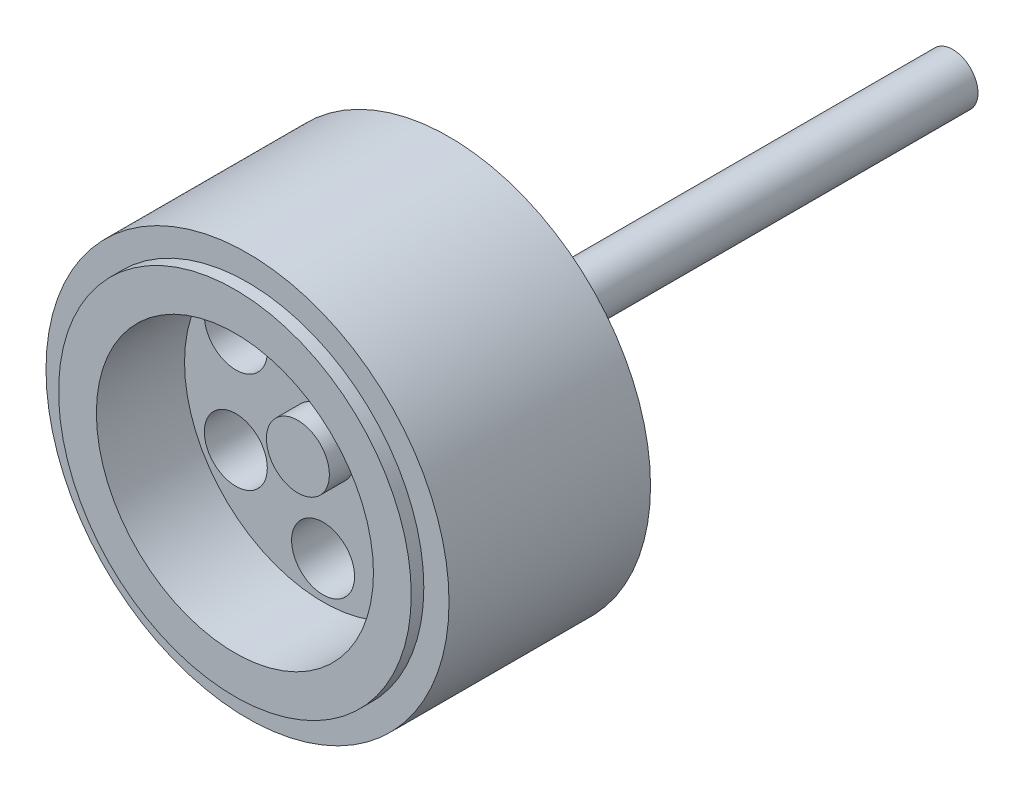
ISO-10303-21;
HEADER;
FILE_DESCRIPTION(('STEP AP214'),'2;1');
FILE_NAME('part.step','',(''),(''),'','','');
FILE_SCHEMA(('AUTOMOTIVE_DESIGN { 1 0 10303 214 1 1 1 1 }'));
ENDSEC;
DATA;
#1=APPLICATION_CONTEXT('core data for automotive mechanical design processes');
#2=APPLICATION_PROTOCOL_DEFINITION('international standard','automotive_design',2000,#1);
#3=PRODUCT_CONTEXT('',#1,'mechanical');
#4=PRODUCT('Part','Part','',(#3));
#5=PRODUCT_RELATED_PRODUCT_CATEGORY('part','',(#4));
#6=PRODUCT_DEFINITION_FORMATION('','',#4);
#7=PRODUCT_DEFINITION_CONTEXT('part definition',#1,'design');
#8=PRODUCT_DEFINITION('design','',#6,#7);
#9=PRODUCT_DEFINITION_SHAPE('','',#8);
#10=(LENGTH_UNIT() NAMED_UNIT(*) SI_UNIT(.MILLI.,.METRE.));
#11=(NAMED_UNIT(*) PLANE_ANGLE_UNIT() SI_UNIT($,.RADIAN.));
#12=(NAMED_UNIT(*) SI_UNIT($,.STERADIAN.) SOLID_ANGLE_UNIT());
#13=UNCERTAINTY_MEASURE_WITH_UNIT(LENGTH_MEASURE(1.E-05),#10,'distance_accuracy_value','');
#14=(GEOMETRIC_REPRESENTATION_CONTEXT(3) GLOBAL_UNCERTAINTY_ASSIGNED_CONTEXT((#13)) GLOBAL_UNIT_ASSIGNED_CONTEXT((#10,
#11,#12)) REPRESENTATION_CONTEXT('',''));
#15=CARTESIAN_POINT('',(0.,0.,0.));
#16=DIRECTION('',(0.,0.,1.));
#17=DIRECTION('',(1.,0.,0.));
#18=AXIS2_PLACEMENT_3D('',#15,#16,#17);
#19=CARTESIAN_POINT('',(0.,0.,0.));
#20=DIRECTION('',(0.,0.,1.));
#21=DIRECTION('',(1.,0.,0.));
#22=AXIS2_PLACEMENT_3D('',#19,#20,#21);
#23=CYLINDRICAL_SURFACE('',#22,32.);
#24=CARTESIAN_POINT('',(0.,0.,11.999));
#25=DIRECTION('',(0.,0.,1.));
#26=DIRECTION('',(1.,0.,0.));
#27=AXIS2_PLACEMENT_3D('',#24,#25,#26);
#28=CIRCLE('',#27,32.);
#29=CARTESIAN_POINT('',(32.,0.,11.999));
#30=VERTEX_POINT('',#29);
#31=EDGE_CURVE('E11',#30,#30,#28,.T.);
#32=ORIENTED_EDGE('',*,*,#31,.F.);
#33=EDGE_LOOP('',(#32));
#34=FACE_BOUND('',#33,.T.);
#35=CARTESIAN_POINT('',(0.,0.,-19.999));
#36=DIRECTION('',(0.,0.,1.));
#37=DIRECTION('',(1.,0.,0.));
#38=AXIS2_PLACEMENT_3D('',#35,#36,#37);
#39=CIRCLE('',#38,32.);
#40=CARTESIAN_POINT('',(32.,0.,-19.999));
#41=VERTEX_POINT('',#40);
#42=EDGE_CURVE('E55',#41,#41,#39,.T.);
#43=ORIENTED_EDGE('',*,*,#42,.T.);
#44=EDGE_LOOP('',(#43));
#45=FACE_BOUND('',#44,.T.);
#46=ADVANCED_FACE('F41',(#34,#45),#23,.T.);
#47=CARTESIAN_POINT('',(0.,32.,11.999));
#48=DIRECTION('',(0.,0.,-1.));
#49=DIRECTION('',(-1.,0.,0.));
#50=AXIS2_PLACEMENT_3D('',#47,#48,#49);
#51=PLANE('',#50);
#52=CARTESIAN_POINT('',(0.,0.,11.999));
#53=DIRECTION('',(0.,0.,1.));
#54=DIRECTION('',(1.,0.,0.));
#55=AXIS2_PLACEMENT_3D('',#52,#53,#54);
#56=CIRCLE('',#55,26.001);
#57=CARTESIAN_POINT('',(26.001,0.,11.999));
#58=VERTEX_POINT('',#57);
#59=EDGE_CURVE('E47',#58,#58,#56,.T.);
#60=ORIENTED_EDGE('',*,*,#59,.F.);
#61=EDGE_LOOP('',(#60));
#62=FACE_BOUND('',#61,.T.);
#63=ORIENTED_EDGE('',*,*,#31,.T.);
#64=EDGE_LOOP('',(#63));
#65=FACE_BOUND('',#64,.T.);
#66=ADVANCED_FACE('F70',(#62,#65),#51,.F.);
#67=CARTESIAN_POINT('',(0.,0.,0.));
#68=DIRECTION('',(0.,0.,1.));
#69=DIRECTION('',(1.,0.,0.));
#70=AXIS2_PLACEMENT_3D('',#67,#68,#69);
#71=CYLINDRICAL_SURFACE('',#70,26.001);
#72=CARTESIAN_POINT('',(0.,0.,-19.999));
#73=DIRECTION('',(0.,0.,1.));
#74=DIRECTION('',(1.,0.,0.));
#75=AXIS2_PLACEMENT_3D('',#72,#73,#74);
#76=CIRCLE('',#75,26.001);
#77=CARTESIAN_POINT('',(26.001,0.,-19.999));
#78=VERTEX_POINT('',#77);
#79=EDGE_CURVE('E51',#78,#78,#76,.T.);
#80=ORIENTED_EDGE('',*,*,#79,.F.);
#81=EDGE_LOOP('',(#80));
#82=FACE_BOUND('',#81,.T.);
#83=ORIENTED_EDGE('',*,*,#59,.T.);
#84=EDGE_LOOP('',(#83));
#85=FACE_BOUND('',#84,.T.);
#86=ADVANCED_FACE('F65',(#82,#85),#71,.F.);
#87=CARTESIAN_POINT('',(0.,26.001,-19.999));
#88=DIRECTION('',(0.,0.,1.));
#89=DIRECTION('',(1.,0.,0.));
#90=AXIS2_PLACEMENT_3D('',#87,#88,#89);
#91=PLANE('',#90);
#92=ORIENTED_EDGE('',*,*,#42,.F.);
#93=EDGE_LOOP('',(#92));
#94=FACE_BOUND('',#93,.T.);
#95=ORIENTED_EDGE('',*,*,#79,.T.);
#96=EDGE_LOOP('',(#95));
#97=FACE_BOUND('',#96,.T.);
#98=ADVANCED_FACE('F62',(#94,#97),#91,.F.);
#99=CLOSED_SHELL('',(#46,#66,#86,#98));
#100=MANIFOLD_SOLID_BREP('B2',#99);
#101=CARTESIAN_POINT('',(0.,22.,-8.));
#102=DIRECTION('',(0.,0.,1.));
#103=DIRECTION('',(1.,0.,0.));
#104=AXIS2_PLACEMENT_3D('',#101,#102,#103);
#105=PLANE('',#104);
#106=CARTESIAN_POINT('',(13.8564064605514,8.00000000000074,-8.));
#107=DIRECTION('',(0.,0.,1.));
#108=DIRECTION('',(1.,0.,0.));
#109=AXIS2_PLACEMENT_3D('',#106,#107,#108);
#110=CIRCLE('',#109,5.);
#111=CARTESIAN_POINT('',(18.8564064605514,8.00000000000074,-8.));
#112=VERTEX_POINT('',#111);
#113=EDGE_CURVE('E156',#112,#112,#110,.F.);
#114=ORIENTED_EDGE('',*,*,#113,.F.);
#115=EDGE_LOOP('',(#114));
#116=FACE_BOUND('',#115,.T.);
#117=CARTESIAN_POINT('',(13.8564064605523,-7.99999999999926,-8.));
#118=DIRECTION('',(0.,0.,1.));
#119=DIRECTION('',(1.,0.,0.));
#120=AXIS2_PLACEMENT_3D('',#117,#118,#119);
#121=CIRCLE('',#120,5.);
#122=CARTESIAN_POINT('',(18.8564064605523,-7.99999999999926,-8.));
#123=VERTEX_POINT('',#122);
#124=EDGE_CURVE('E171',#123,#123,#121,.F.);
#125=ORIENTED_EDGE('',*,*,#124,.F.);
#126=EDGE_LOOP('',(#125));
#127=FACE_BOUND('',#126,.T.);
#128=CARTESIAN_POINT('',(1.7021889376992E-12,-16.,-8.));
#129=DIRECTION('',(0.,0.,1.));
#130=DIRECTION('',(1.,0.,0.));
#131=AXIS2_PLACEMENT_3D('',#128,#129,#130);
#132=CIRCLE('',#131,5.);
#133=CARTESIAN_POINT('',(5.0000000000017,-16.,-8.));
#134=VERTEX_POINT('',#133);
#135=EDGE_CURVE('E165',#134,#134,#132,.F.);
#136=ORIENTED_EDGE('',*,*,#135,.F.);
#137=EDGE_LOOP('',(#136));
#138=FACE_BOUND('',#137,.T.);
#139=CARTESIAN_POINT('',(-13.8564064605506,7.99999999999925,-8.));
#140=DIRECTION('',(0.,0.,1.));
#141=DIRECTION('',(1.,0.,0.));
#142=AXIS2_PLACEMENT_3D('',#139,#140,#141);
#143=CIRCLE('',#142,5.);
#144=CARTESIAN_POINT('',(-8.8564064605506,7.99999999999925,-8.));
#145=VERTEX_POINT('',#144);
#146=EDGE_CURVE('E164',#145,#145,#143,.F.);
#147=ORIENTED_EDGE('',*,*,#146,.F.);
#148=EDGE_LOOP('',(#147));
#149=FACE_BOUND('',#148,.T.);
#150=CARTESIAN_POINT('',(0.,16.,-8.));
#151=DIRECTION('',(0.,0.,1.));
#152=DIRECTION('',(1.,0.,0.));
#153=AXIS2_PLACEMENT_3D('',#150,#151,#152);
#154=CIRCLE('',#153,5.);
#155=CARTESIAN_POINT('',(5.,16.,-8.));
#156=VERTEX_POINT('',#155);
#157=EDGE_CURVE('E150',#156,#156,#154,.F.);
#158=ORIENTED_EDGE('',*,*,#157,.F.);
#159=EDGE_LOOP('',(#158));
#160=FACE_BOUND('',#159,.T.);
#161=CARTESIAN_POINT('',(0.,0.,-8.));
#162=DIRECTION('',(0.,0.,1.));
#163=DIRECTION('',(1.,0.,0.));
#164=AXIS2_PLACEMENT_3D('',#161,#162,#163);
#165=CIRCLE('',#164,22.);
#166=CARTESIAN_POINT('',(22.,0.,-8.));
#167=VERTEX_POINT('',#166);
#168=EDGE_CURVE('E40',#167,#167,#165,.T.);
#169=ORIENTED_EDGE('',*,*,#168,.F.);
#170=EDGE_LOOP('',(#169));
#171=FACE_BOUND('',#170,.T.);
#172=CARTESIAN_POINT('',(0.,0.,-8.));
#173=DIRECTION('',(0.,0.,1.));
#174=DIRECTION('',(1.,0.,0.));
#175=AXIS2_PLACEMENT_3D('',#172,#173,#174);
#176=CIRCLE('',#175,10.);
#177=CARTESIAN_POINT('',(10.,0.,-8.));
#178=VERTEX_POINT('',#177);
#179=EDGE_CURVE('E110',#178,#178,#176,.T.);
#180=ORIENTED_EDGE('',*,*,#179,.T.);
#181=EDGE_LOOP('',(#180));
#182=FACE_BOUND('',#181,.T.);
#183=CARTESIAN_POINT('',(-13.8564064605497,-8.00000000000074,-8.));
#184=DIRECTION('',(0.,0.,1.));
#185=DIRECTION('',(1.,0.,0.));
#186=AXIS2_PLACEMENT_3D('',#183,#184,#185);
#187=CIRCLE('',#186,5.);
#188=CARTESIAN_POINT('',(-8.85640646054974,-8.00000000000074,-8.));
#189=VERTEX_POINT('',#188);
#190=EDGE_CURVE('E157',#189,#189,#187,.F.);
#191=ORIENTED_EDGE('',*,*,#190,.F.);
#192=EDGE_LOOP('',(#191));
#193=FACE_BOUND('',#192,.T.);
#194=ADVANCED_FACE('F103',(#116,#127,#138,#149,#160,#171,#182,#193),#105,.F.);
#195=CARTESIAN_POINT('',(0.,0.,0.));
#196=DIRECTION('',(0.,0.,1.));
#197=DIRECTION('',(1.,0.,0.));
#198=AXIS2_PLACEMENT_3D('',#195,#196,#197);
#199=CYLINDRICAL_SURFACE('',#198,22.);
#200=CARTESIAN_POINT('',(0.,0.,-22.));
#201=DIRECTION('',(0.,0.,1.));
#202=DIRECTION('',(1.,0.,0.));
#203=AXIS2_PLACEMENT_3D('',#200,#201,#202);
#204=CIRCLE('',#203,22.);
#205=CARTESIAN_POINT('',(22.,0.,-22.));
#206=VERTEX_POINT('',#205);
#207=EDGE_CURVE('E147',#206,#206,#204,.T.);
#208=ORIENTED_EDGE('',*,*,#207,.F.);
#209=EDGE_LOOP('',(#208));
#210=FACE_BOUND('',#209,.T.);
#211=ORIENTED_EDGE('',*,*,#168,.T.);
#212=EDGE_LOOP('',(#211));
#213=FACE_BOUND('',#212,.T.);
#214=ADVANCED_FACE('F105',(#210,#213),#199,.F.);
#215=CARTESIAN_POINT('',(0.,0.,0.));
#216=DIRECTION('',(0.,0.,1.));
#217=DIRECTION('',(1.,0.,0.));
#218=AXIS2_PLACEMENT_3D('',#215,#216,#217);
#219=CYLINDRICAL_SURFACE('',#218,10.);
#220=ORIENTED_EDGE('',*,*,#179,.F.);
#221=EDGE_LOOP('',(#220));
#222=FACE_BOUND('',#221,.T.);
#223=CARTESIAN_POINT('',(0.,0.,-22.));
#224=DIRECTION('',(0.,0.,1.));
#225=DIRECTION('',(1.,0.,0.));
#226=AXIS2_PLACEMENT_3D('',#223,#224,#225);
#227=CIRCLE('',#226,10.);
#228=CARTESIAN_POINT('',(10.,0.,-22.));
#229=VERTEX_POINT('',#228);
#230=EDGE_CURVE('E114',#229,#229,#227,.T.);
#231=ORIENTED_EDGE('',*,*,#230,.T.);
#232=EDGE_LOOP('',(#231));
#233=FACE_BOUND('',#232,.T.);
#234=ADVANCED_FACE('F282',(#222,#233),#219,.T.);
#235=CARTESIAN_POINT('',(0.,10.,-22.));
#236=DIRECTION('',(0.,0.,1.));
#237=DIRECTION('',(1.,0.,0.));
#238=AXIS2_PLACEMENT_3D('',#235,#236,#237);
#239=PLANE('',#238);
#240=ORIENTED_EDGE('',*,*,#230,.F.);
#241=EDGE_LOOP('',(#240));
#242=FACE_BOUND('',#241,.T.);
#243=CARTESIAN_POINT('',(0.,0.,-22.));
#244=DIRECTION('',(0.,0.,1.));
#245=DIRECTION('',(1.,0.,0.));
#246=AXIS2_PLACEMENT_3D('',#243,#244,#245);
#247=CIRCLE('',#246,4.);
#248=CARTESIAN_POINT('',(4.,0.,-22.));
#249=VERTEX_POINT('',#248);
#250=EDGE_CURVE('E186',#249,#249,#247,.F.);
#251=ORIENTED_EDGE('',*,*,#250,.F.);
#252=EDGE_LOOP('',(#251));
#253=FACE_BOUND('',#252,.T.);
#254=ADVANCED_FACE('F228',(#242,#253),#239,.F.);
#255=CARTESIAN_POINT('',(0.,4.,0.));
#256=DIRECTION('',(0.,0.,-1.));
#257=DIRECTION('',(-1.,0.,0.));
#258=AXIS2_PLACEMENT_3D('',#255,#256,#257);
#259=PLANE('',#258);
#260=CARTESIAN_POINT('',(13.8564064605514,8.00000000000074,0.));
#261=DIRECTION('',(0.,0.,1.));
#262=DIRECTION('',(1.,0.,0.));
#263=AXIS2_PLACEMENT_3D('',#260,#261,#262);
#264=CIRCLE('',#263,5.);
#265=CARTESIAN_POINT('',(18.8564064605514,8.00000000000074,0.));
#266=VERTEX_POINT('',#265);
#267=EDGE_CURVE('E174',#266,#266,#264,.T.);
#268=ORIENTED_EDGE('',*,*,#267,.F.);
#269=EDGE_LOOP('',(#268));
#270=FACE_BOUND('',#269,.T.);
#271=CARTESIAN_POINT('',(13.8564064605523,-7.99999999999926,0.));
#272=DIRECTION('',(0.,0.,1.));
#273=DIRECTION('',(1.,0.,0.));
#274=AXIS2_PLACEMENT_3D('',#271,#272,#273);
#275=CIRCLE('',#274,5.);
#276=CARTESIAN_POINT('',(18.8564064605523,-7.99999999999926,0.));
#277=VERTEX_POINT('',#276);
#278=EDGE_CURVE('E168',#277,#277,#275,.T.);
#279=ORIENTED_EDGE('',*,*,#278,.F.);
#280=EDGE_LOOP('',(#279));
#281=FACE_BOUND('',#280,.T.);
#282=CARTESIAN_POINT('',(1.7021889376992E-12,-16.,0.));
#283=DIRECTION('',(0.,0.,1.));
#284=DIRECTION('',(1.,0.,0.));
#285=AXIS2_PLACEMENT_3D('',#282,#283,#284);
#286=CIRCLE('',#285,5.);
#287=CARTESIAN_POINT('',(5.0000000000017,-16.,0.));
#288=VERTEX_POINT('',#287);
#289=EDGE_CURVE('E160',#288,#288,#286,.T.);
#290=ORIENTED_EDGE('',*,*,#289,.F.);
#291=EDGE_LOOP('',(#290));
#292=FACE_BOUND('',#291,.T.);
#293=CARTESIAN_POINT('',(-13.8564064605497,-8.00000000000074,0.));
#294=DIRECTION('',(0.,0.,1.));
#295=DIRECTION('',(1.,0.,0.));
#296=AXIS2_PLACEMENT_3D('',#293,#294,#295);
#297=CIRCLE('',#296,5.);
#298=CARTESIAN_POINT('',(-8.85640646054974,-8.00000000000074,0.));
#299=VERTEX_POINT('',#298);
#300=EDGE_CURVE('E161',#299,#299,#297,.T.);
#301=ORIENTED_EDGE('',*,*,#300,.F.);
#302=EDGE_LOOP('',(#301));
#303=FACE_BOUND('',#302,.T.);
#304=CARTESIAN_POINT('',(-13.8564064605506,7.99999999999925,0.));
#305=DIRECTION('',(0.,0.,1.));
#306=DIRECTION('',(1.,0.,0.));
#307=AXIS2_PLACEMENT_3D('',#304,#305,#306);
#308=CIRCLE('',#307,5.);
#309=CARTESIAN_POINT('',(-8.8564064605506,7.99999999999925,0.));
#310=VERTEX_POINT('',#309);
#311=EDGE_CURVE('E183',#310,#310,#308,.T.);
#312=ORIENTED_EDGE('',*,*,#311,.F.);
#313=EDGE_LOOP('',(#312));
#314=FACE_BOUND('',#313,.T.);
#315=CARTESIAN_POINT('',(0.,16.,0.));
#316=DIRECTION('',(0.,0.,1.));
#317=DIRECTION('',(1.,0.,0.));
#318=AXIS2_PLACEMENT_3D('',#315,#316,#317);
#319=CIRCLE('',#318,5.);
#320=CARTESIAN_POINT('',(5.,16.,0.));
#321=VERTEX_POINT('',#320);
#322=EDGE_CURVE('E153',#321,#321,#319,.T.);
#323=ORIENTED_EDGE('',*,*,#322,.F.);
#324=EDGE_LOOP('',(#323));
#325=FACE_BOUND('',#324,.T.);
#326=CARTESIAN_POINT('',(0.,0.,0.));
#327=DIRECTION('',(0.,0.,1.));
#328=DIRECTION('',(1.,0.,0.));
#329=AXIS2_PLACEMENT_3D('',#326,#327,#328);
#330=CIRCLE('',#329,4.);
#331=CARTESIAN_POINT('',(4.,0.,0.));
#332=VERTEX_POINT('',#331);
#333=EDGE_CURVE('E118',#332,#332,#330,.T.);
#334=ORIENTED_EDGE('',*,*,#333,.F.);
#335=EDGE_LOOP('',(#334));
#336=FACE_BOUND('',#335,.T.);
#337=CARTESIAN_POINT('',(0.,0.,0.));
#338=DIRECTION('',(0.,0.,1.));
#339=DIRECTION('',(1.,0.,0.));
#340=AXIS2_PLACEMENT_3D('',#337,#338,#339);
#341=CIRCLE('',#340,22.);
#342=CARTESIAN_POINT('',(22.,0.,0.));
#343=VERTEX_POINT('',#342);
#344=EDGE_CURVE('E123',#343,#343,#341,.T.);
#345=ORIENTED_EDGE('',*,*,#344,.T.);
#346=EDGE_LOOP('',(#345));
#347=FACE_BOUND('',#346,.T.);
#348=ADVANCED_FACE('F224',(#270,#281,#292,#303,#314,#325,#336,#347),#259,.F.);
#349=CARTESIAN_POINT('',(0.,0.,0.));
#350=DIRECTION('',(0.,0.,1.));
#351=DIRECTION('',(1.,0.,0.));
#352=AXIS2_PLACEMENT_3D('',#349,#350,#351);
#353=CYLINDRICAL_SURFACE('',#352,22.);
#354=ORIENTED_EDGE('',*,*,#344,.F.);
#355=EDGE_LOOP('',(#354));
#356=FACE_BOUND('',#355,.T.);
#357=CARTESIAN_POINT('',(0.,0.,14.));
#358=DIRECTION('',(0.,0.,1.));
#359=DIRECTION('',(1.,0.,0.));
#360=AXIS2_PLACEMENT_3D('',#357,#358,#359);
#361=CIRCLE('',#360,22.);
#362=CARTESIAN_POINT('',(22.,0.,14.));
#363=VERTEX_POINT('',#362);
#364=EDGE_CURVE('E126',#363,#363,#361,.T.);
#365=ORIENTED_EDGE('',*,*,#364,.T.);
#366=EDGE_LOOP('',(#365));
#367=FACE_BOUND('',#366,.T.);
#368=ADVANCED_FACE('F227',(#356,#367),#353,.F.);
#369=CARTESIAN_POINT('',(0.,22.,14.));
#370=DIRECTION('',(0.,0.,-1.));
#371=DIRECTION('',(-1.,0.,0.));
#372=AXIS2_PLACEMENT_3D('',#369,#370,#371);
#373=PLANE('',#372);
#374=ORIENTED_EDGE('',*,*,#364,.F.);
#375=EDGE_LOOP('',(#374));
#376=FACE_BOUND('',#375,.T.);
#377=CARTESIAN_POINT('',(0.,0.,14.));
#378=DIRECTION('',(0.,0.,1.));
#379=DIRECTION('',(1.,0.,0.));
#380=AXIS2_PLACEMENT_3D('',#377,#378,#379);
#381=CIRCLE('',#380,28.);
#382=CARTESIAN_POINT('',(28.,0.,14.));
#383=VERTEX_POINT('',#382);
#384=EDGE_CURVE('E129',#383,#383,#381,.T.);
#385=ORIENTED_EDGE('',*,*,#384,.T.);
#386=EDGE_LOOP('',(#385));
#387=FACE_BOUND('',#386,.T.);
#388=ADVANCED_FACE('F235',(#376,#387),#373,.F.);
#389=CARTESIAN_POINT('',(0.,0.,0.));
#390=DIRECTION('',(0.,0.,1.));
#391=DIRECTION('',(1.,0.,0.));
#392=AXIS2_PLACEMENT_3D('',#389,#390,#391);
#393=CYLINDRICAL_SURFACE('',#392,28.);
#394=ORIENTED_EDGE('',*,*,#384,.F.);
#395=EDGE_LOOP('',(#394));
#396=FACE_BOUND('',#395,.T.);
#397=CARTESIAN_POINT('',(0.,0.,12.));
#398=DIRECTION('',(0.,0.,1.));
#399=DIRECTION('',(1.,0.,0.));
#400=AXIS2_PLACEMENT_3D('',#397,#398,#399);
#401=CIRCLE('',#400,28.);
#402=CARTESIAN_POINT('',(28.,0.,12.));
#403=VERTEX_POINT('',#402);
#404=EDGE_CURVE('E132',#403,#403,#401,.T.);
#405=ORIENTED_EDGE('',*,*,#404,.T.);
#406=EDGE_LOOP('',(#405));
#407=FACE_BOUND('',#406,.T.);
#408=ADVANCED_FACE('F241',(#396,#407),#393,.T.);
#409=CARTESIAN_POINT('',(0.,28.,12.));
#410=DIRECTION('',(0.,0.,1.));
#411=DIRECTION('',(1.,0.,0.));
#412=AXIS2_PLACEMENT_3D('',#409,#410,#411);
#413=PLANE('',#412);
#414=ORIENTED_EDGE('',*,*,#404,.F.);
#415=EDGE_LOOP('',(#414));
#416=FACE_BOUND('',#415,.T.);
#417=CARTESIAN_POINT('',(0.,0.,12.));
#418=DIRECTION('',(0.,0.,1.));
#419=DIRECTION('',(1.,0.,0.));
#420=AXIS2_PLACEMENT_3D('',#417,#418,#419);
#421=CIRCLE('',#420,26.);
#422=CARTESIAN_POINT('',(26.,0.,12.));
#423=VERTEX_POINT('',#422);
#424=EDGE_CURVE('E135',#423,#423,#421,.T.);
#425=ORIENTED_EDGE('',*,*,#424,.T.);
#426=EDGE_LOOP('',(#425));
#427=FACE_BOUND('',#426,.T.);
#428=ADVANCED_FACE('F247',(#416,#427),#413,.F.);
#429=CARTESIAN_POINT('',(0.,0.,0.));
#430=DIRECTION('',(0.,0.,1.));
#431=DIRECTION('',(1.,0.,0.));
#432=AXIS2_PLACEMENT_3D('',#429,#430,#431);
#433=CYLINDRICAL_SURFACE('',#432,26.);
#434=ORIENTED_EDGE('',*,*,#424,.F.);
#435=EDGE_LOOP('',(#434));
#436=FACE_BOUND('',#435,.T.);
#437=CARTESIAN_POINT('',(0.,0.,-20.));
#438=DIRECTION('',(0.,0.,1.));
#439=DIRECTION('',(1.,0.,0.));
#440=AXIS2_PLACEMENT_3D('',#437,#438,#439);
#441=CIRCLE('',#440,26.);
#442=CARTESIAN_POINT('',(26.,0.,-20.));
#443=VERTEX_POINT('',#442);
#444=EDGE_CURVE('E138',#443,#443,#441,.T.);
#445=ORIENTED_EDGE('',*,*,#444,.T.);
#446=EDGE_LOOP('',(#445));
#447=FACE_BOUND('',#446,.T.);
#448=ADVANCED_FACE('F253',(#436,#447),#433,.T.);
#449=CARTESIAN_POINT('',(0.,26.,-20.));
#450=DIRECTION('',(0.,0.,-1.));
#451=DIRECTION('',(-1.,0.,0.));
#452=AXIS2_PLACEMENT_3D('',#449,#450,#451);
#453=PLANE('',#452);
#454=ORIENTED_EDGE('',*,*,#444,.F.);
#455=EDGE_LOOP('',(#454));
#456=FACE_BOUND('',#455,.T.);
#457=CARTESIAN_POINT('',(0.,0.,-20.));
#458=DIRECTION('',(0.,0.,1.));
#459=DIRECTION('',(1.,0.,0.));
#460=AXIS2_PLACEMENT_3D('',#457,#458,#459);
#461=CIRCLE('',#460,28.);
#462=CARTESIAN_POINT('',(28.,0.,-20.));
#463=VERTEX_POINT('',#462);
#464=EDGE_CURVE('E141',#463,#463,#461,.T.);
#465=ORIENTED_EDGE('',*,*,#464,.T.);
#466=EDGE_LOOP('',(#465));
#467=FACE_BOUND('',#466,.T.);
#468=ADVANCED_FACE('F259',(#456,#467),#453,.F.);
#469=CARTESIAN_POINT('',(0.,0.,0.));
#470=DIRECTION('',(0.,0.,1.));
#471=DIRECTION('',(1.,0.,0.));
#472=AXIS2_PLACEMENT_3D('',#469,#470,#471);
#473=CYLINDRICAL_SURFACE('',#472,28.);
#474=ORIENTED_EDGE('',*,*,#464,.F.);
#475=EDGE_LOOP('',(#474));
#476=FACE_BOUND('',#475,.T.);
#477=CARTESIAN_POINT('',(0.,0.,-22.));
#478=DIRECTION('',(0.,0.,1.));
#479=DIRECTION('',(1.,0.,0.));
#480=AXIS2_PLACEMENT_3D('',#477,#478,#479);
#481=CIRCLE('',#480,28.);
#482=CARTESIAN_POINT('',(28.,0.,-22.));
#483=VERTEX_POINT('',#482);
#484=EDGE_CURVE('E144',#483,#483,#481,.T.);
#485=ORIENTED_EDGE('',*,*,#484,.T.);
#486=EDGE_LOOP('',(#485));
#487=FACE_BOUND('',#486,.T.);
#488=ADVANCED_FACE('F265',(#476,#487),#473,.T.);
#489=CARTESIAN_POINT('',(0.,28.,-22.));
#490=DIRECTION('',(0.,0.,1.));
#491=DIRECTION('',(1.,0.,0.));
#492=AXIS2_PLACEMENT_3D('',#489,#490,#491);
#493=PLANE('',#492);
#494=ORIENTED_EDGE('',*,*,#484,.F.);
#495=EDGE_LOOP('',(#494));
#496=FACE_BOUND('',#495,.T.);
#497=ORIENTED_EDGE('',*,*,#207,.T.);
#498=EDGE_LOOP('',(#497));
#499=FACE_BOUND('',#498,.T.);
#500=ADVANCED_FACE('F271',(#496,#499),#493,.F.);
#501=CARTESIAN_POINT('',(0.,16.,-22.142135623731));
#502=DIRECTION('',(0.,0.,1.));
#503=DIRECTION('',(1.,0.,0.));
#504=AXIS2_PLACEMENT_3D('',#501,#502,#503);
#505=CYLINDRICAL_SURFACE('',#504,5.);
#506=ORIENTED_EDGE('',*,*,#157,.T.);
#507=EDGE_LOOP('',(#506));
#508=FACE_BOUND('',#507,.T.);
#509=ORIENTED_EDGE('',*,*,#322,.T.);
#510=EDGE_LOOP('',(#509));
#511=FACE_BOUND('',#510,.T.);
#512=ADVANCED_FACE('F277',(#508,#511),#505,.F.);
#513=CARTESIAN_POINT('',(-13.8564064605506,7.99999999999925,-22.142135623731));
#514=DIRECTION('',(0.,0.,1.));
#515=DIRECTION('',(1.,0.,0.));
#516=AXIS2_PLACEMENT_3D('',#513,#514,#515);
#517=CYLINDRICAL_SURFACE('',#516,5.);
#518=ORIENTED_EDGE('',*,*,#146,.T.);
#519=EDGE_LOOP('',(#518));
#520=FACE_BOUND('',#519,.T.);
#521=ORIENTED_EDGE('',*,*,#311,.T.);
#522=EDGE_LOOP('',(#521));
#523=FACE_BOUND('',#522,.T.);
#524=ADVANCED_FACE('F300',(#520,#523),#517,.F.);
#525=CARTESIAN_POINT('',(-13.8564064605497,-8.00000000000074,-22.142135623731));
#526=DIRECTION('',(0.,0.,1.));
#527=DIRECTION('',(1.,0.,0.));
#528=AXIS2_PLACEMENT_3D('',#525,#526,#527);
#529=CYLINDRICAL_SURFACE('',#528,5.);
#530=ORIENTED_EDGE('',*,*,#190,.T.);
#531=EDGE_LOOP('',(#530));
#532=FACE_BOUND('',#531,.T.);
#533=ORIENTED_EDGE('',*,*,#300,.T.);
#534=EDGE_LOOP('',(#533));
#535=FACE_BOUND('',#534,.T.);
#536=ADVANCED_FACE('F302',(#532,#535),#529,.F.);
#537=CARTESIAN_POINT('',(1.7021889376992E-12,-16.,-22.142135623731));
#538=DIRECTION('',(0.,0.,1.));
#539=DIRECTION('',(1.,0.,0.));
#540=AXIS2_PLACEMENT_3D('',#537,#538,#539);
#541=CYLINDRICAL_SURFACE('',#540,5.);
#542=ORIENTED_EDGE('',*,*,#135,.T.);
#543=EDGE_LOOP('',(#542));
#544=FACE_BOUND('',#543,.T.);
#545=ORIENTED_EDGE('',*,*,#289,.T.);
#546=EDGE_LOOP('',(#545));
#547=FACE_BOUND('',#546,.T.);
#548=ADVANCED_FACE('F305',(#544,#547),#541,.F.);
#549=CARTESIAN_POINT('',(13.8564064605523,-7.99999999999926,-22.142135623731));
#550=DIRECTION('',(0.,0.,1.));
#551=DIRECTION('',(1.,0.,0.));
#552=AXIS2_PLACEMENT_3D('',#549,#550,#551);
#553=CYLINDRICAL_SURFACE('',#552,5.);
#554=ORIENTED_EDGE('',*,*,#124,.T.);
#555=EDGE_LOOP('',(#554));
#556=FACE_BOUND('',#555,.T.);
#557=ORIENTED_EDGE('',*,*,#278,.T.);
#558=EDGE_LOOP('',(#557));
#559=FACE_BOUND('',#558,.T.);
#560=ADVANCED_FACE('F309',(#556,#559),#553,.F.);
#561=CARTESIAN_POINT('',(13.8564064605514,8.00000000000074,-22.142135623731));
#562=DIRECTION('',(0.,0.,1.));
#563=DIRECTION('',(1.,0.,0.));
#564=AXIS2_PLACEMENT_3D('',#561,#562,#563);
#565=CYLINDRICAL_SURFACE('',#564,5.);
#566=ORIENTED_EDGE('',*,*,#113,.T.);
#567=EDGE_LOOP('',(#566));
#568=FACE_BOUND('',#567,.T.);
#569=ORIENTED_EDGE('',*,*,#267,.T.);
#570=EDGE_LOOP('',(#569));
#571=FACE_BOUND('',#570,.T.);
#572=ADVANCED_FACE('F208',(#568,#571),#565,.F.);
#573=CARTESIAN_POINT('',(0.,0.,4.001));
#574=DIRECTION('',(0.,0.,1.));
#575=DIRECTION('',(1.,0.,0.));
#576=AXIS2_PLACEMENT_3D('',#573,#574,#575);
#577=CYLINDRICAL_SURFACE('',#576,5.);
#578=CARTESIAN_POINT('',(0.,0.,4.001));
#579=DIRECTION('',(0.,0.,1.));
#580=DIRECTION('',(1.,0.,0.));
#581=AXIS2_PLACEMENT_3D('',#578,#579,#580);
#582=CIRCLE('',#581,5.);
#583=CARTESIAN_POINT('',(5.,0.,4.001));
#584=VERTEX_POINT('',#583);
#585=EDGE_CURVE('E198',#584,#584,#582,.T.);
#586=ORIENTED_EDGE('',*,*,#585,.F.);
#587=EDGE_LOOP('',(#586));
#588=FACE_BOUND('',#587,.T.);
#589=CARTESIAN_POINT('',(0.,0.,0.001000000000001));
#590=DIRECTION('',(0.,0.,1.));
#591=DIRECTION('',(1.,0.,0.));
#592=AXIS2_PLACEMENT_3D('',#589,#590,#591);
#593=CIRCLE('',#592,5.);
#594=CARTESIAN_POINT('',(5.,0.,0.001000000000001));
#595=VERTEX_POINT('',#594);
#596=EDGE_CURVE('E195',#595,#595,#593,.T.);
#597=ORIENTED_EDGE('',*,*,#596,.T.);
#598=EDGE_LOOP('',(#597));
#599=FACE_BOUND('',#598,.T.);
#600=ADVANCED_FACE('F204',(#588,#599),#577,.T.);
#601=CARTESIAN_POINT('',(0.,4.,0.00100000000000056));
#602=DIRECTION('',(0.,0.,1.));
#603=DIRECTION('',(1.,0.,0.));
#604=AXIS2_PLACEMENT_3D('',#601,#602,#603);
#605=PLANE('',#604);
#606=ORIENTED_EDGE('',*,*,#596,.F.);
#607=EDGE_LOOP('',(#606));
#608=FACE_BOUND('',#607,.T.);
#609=CARTESIAN_POINT('',(0.,0.,0.00100000000000013));
#610=DIRECTION('',(0.,0.,1.));
#611=DIRECTION('',(1.,0.,0.));
#612=AXIS2_PLACEMENT_3D('',#609,#610,#611);
#613=CIRCLE('',#612,4.);
#614=CARTESIAN_POINT('',(4.,0.,0.00100000000000013));
#615=VERTEX_POINT('',#614);
#616=EDGE_CURVE('E192',#615,#615,#613,.T.);
#617=ORIENTED_EDGE('',*,*,#616,.T.);
#618=EDGE_LOOP('',(#617));
#619=FACE_BOUND('',#618,.T.);
#620=ADVANCED_FACE('F207',(#608,#619),#605,.F.);
#621=CARTESIAN_POINT('',(0.,5.,4.001));
#622=DIRECTION('',(0.,0.,-1.));
#623=DIRECTION('',(-1.,0.,0.));
#624=AXIS2_PLACEMENT_3D('',#621,#622,#623);
#625=PLANE('',#624);
#626=ORIENTED_EDGE('',*,*,#585,.T.);
#627=EDGE_LOOP('',(#626));
#628=FACE_BOUND('',#627,.T.);
#629=ADVANCED_FACE('F202',(#628),#625,.F.);
#630=CARTESIAN_POINT('',(0.,0.,4.001));
#631=DIRECTION('',(0.,0.,1.));
#632=DIRECTION('',(1.,0.,0.));
#633=AXIS2_PLACEMENT_3D('',#630,#631,#632);
#634=CYLINDRICAL_SURFACE('',#633,4.);
#635=ORIENTED_EDGE('',*,*,#616,.F.);
#636=EDGE_LOOP('',(#635));
#637=FACE_BOUND('',#636,.T.);
#638=ORIENTED_EDGE('',*,*,#333,.T.);
#639=EDGE_LOOP('',(#638));
#640=FACE_BOUND('',#639,.T.);
#641=ADVANCED_FACE('F217',(#637,#640),#634,.T.);
#642=CARTESIAN_POINT('',(0.,0.,-99.999));
#643=DIRECTION('',(0.,0.,1.));
#644=DIRECTION('',(1.,0.,0.));
#645=AXIS2_PLACEMENT_3D('',#642,#643,#644);
#646=CIRCLE('',#645,4.);
#647=CARTESIAN_POINT('',(4.,0.,-99.999));
#648=VERTEX_POINT('',#647);
#649=EDGE_CURVE('E189',#648,#648,#646,.T.);
#650=ORIENTED_EDGE('',*,*,#649,.T.);
#651=EDGE_LOOP('',(#650));
#652=FACE_BOUND('',#651,.T.);
#653=ORIENTED_EDGE('',*,*,#250,.T.);
#654=EDGE_LOOP('',(#653));
#655=FACE_BOUND('',#654,.T.);
#656=ADVANCED_FACE('F220',(#652,#655),#634,.T.);
#657=CARTESIAN_POINT('',(0.,4.,-99.999));
#658=DIRECTION('',(0.,0.,1.));
#659=DIRECTION('',(1.,0.,0.));
#660=AXIS2_PLACEMENT_3D('',#657,#658,#659);
#661=PLANE('',#660);
#662=ORIENTED_EDGE('',*,*,#649,.F.);
#663=EDGE_LOOP('',(#662));
#664=FACE_BOUND('',#663,.T.);
#665=ADVANCED_FACE('F322',(#664),#661,.F.);
#666=CLOSED_SHELL('',(#194,#214,#234,#254,#348,#368,#388,#408,#428,#448,#468,#488,#500,#512,
#524,#536,#548,#560,#572,#600,#620,#629,#641,#656,#665));
#667=MANIFOLD_SOLID_BREP('B6',#666);
#668=ADVANCED_BREP_SHAPE_REPRESENTATION('',(#18,#100,#667),#14);
#669=SHAPE_DEFINITION_REPRESENTATION(#9,#668);
ENDSEC;
END-ISO-10303-21;
